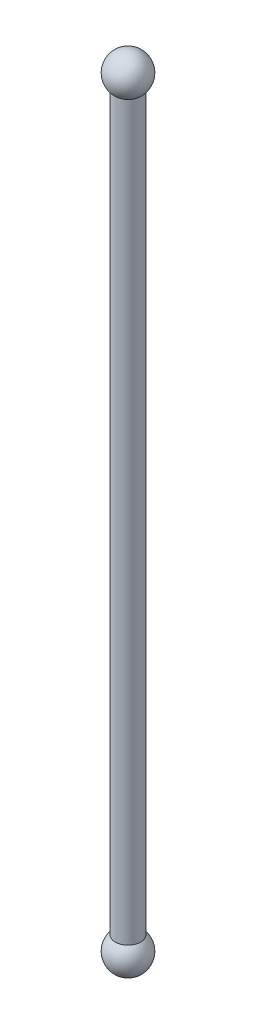
ISO-10303-21;
HEADER;
FILE_DESCRIPTION(('STEP AP214'),'2;1');
FILE_NAME('part.step','',(''),(''),'','','');
FILE_SCHEMA(('AUTOMOTIVE_DESIGN { 1 0 10303 214 1 1 1 1 }'));
ENDSEC;
DATA;
#1=APPLICATION_CONTEXT('core data for automotive mechanical design processes');
#2=APPLICATION_PROTOCOL_DEFINITION('international standard','automotive_design',2000,#1);
#3=PRODUCT_CONTEXT('',#1,'mechanical');
#4=PRODUCT('Part','Part','',(#3));
#5=PRODUCT_RELATED_PRODUCT_CATEGORY('part','',(#4));
#6=PRODUCT_DEFINITION_FORMATION('','',#4);
#7=PRODUCT_DEFINITION_CONTEXT('part definition',#1,'design');
#8=PRODUCT_DEFINITION('design','',#6,#7);
#9=PRODUCT_DEFINITION_SHAPE('','',#8);
#10=(LENGTH_UNIT() NAMED_UNIT(*) SI_UNIT(.MILLI.,.METRE.));
#11=(NAMED_UNIT(*) PLANE_ANGLE_UNIT() SI_UNIT($,.RADIAN.));
#12=(NAMED_UNIT(*) SI_UNIT($,.STERADIAN.) SOLID_ANGLE_UNIT());
#13=UNCERTAINTY_MEASURE_WITH_UNIT(LENGTH_MEASURE(1.E-05),#10,'distance_accuracy_value','');
#14=(GEOMETRIC_REPRESENTATION_CONTEXT(3) GLOBAL_UNCERTAINTY_ASSIGNED_CONTEXT((#13)) GLOBAL_UNIT_ASSIGNED_CONTEXT((#10,
#11,#12)) REPRESENTATION_CONTEXT('',''));
#15=CARTESIAN_POINT('',(0.,0.,0.));
#16=DIRECTION('',(0.,0.,1.));
#17=DIRECTION('',(1.,0.,0.));
#18=AXIS2_PLACEMENT_3D('',#15,#16,#17);
#19=CARTESIAN_POINT('',(0.,150.,0.));
#20=DIRECTION('',(0.,-1.,0.));
#21=DIRECTION('',(0.,0.,-1.));
#22=AXIS2_PLACEMENT_3D('',#19,#20,#21);
#23=CYLINDRICAL_SURFACE('',#22,5.);
#24=CARTESIAN_POINT('',(0.,144.409830056251,0.));
#25=DIRECTION('',(0.,0.999999999999998,0.));
#26=DIRECTION('',(0.,0.,1.));
#27=AXIS2_PLACEMENT_3D('',#24,#25,#26);
#28=CIRCLE('',#27,5.);
#29=CARTESIAN_POINT('',(0.,144.409830056251,-5.));
#30=VERTEX_POINT('',#29);
#31=EDGE_CURVE('E45',#30,#30,#28,.T.);
#32=CARTESIAN_POINT('',(0.,-144.409830056251,0.));
#33=DIRECTION('',(0.,-0.999999999999998,0.));
#34=DIRECTION('',(0.,0.,-1.));
#35=AXIS2_PLACEMENT_3D('',#32,#33,#34);
#36=CIRCLE('',#35,5.);
#37=CARTESIAN_POINT('',(0.,-144.409830056251,-5.));
#38=VERTEX_POINT('',#37);
#39=EDGE_CURVE('E10',#38,#38,#36,.T.);
#40=CARTESIAN_POINT('',(0.,144.409830056251,-5.));
#41=CARTESIAN_POINT('',(0.,141.401291930079,-5.));
#42=CARTESIAN_POINT('',(0.,138.392753803907,-5.));
#43=CARTESIAN_POINT('',(0.,132.375677551563,-5.));
#44=CARTESIAN_POINT('',(0.,129.367139425391,-5.));
#45=CARTESIAN_POINT('',(0.,123.350063173047,-5.));
#46=CARTESIAN_POINT('',(0.,120.341525046875,-5.));
#47=CARTESIAN_POINT('',(0.,114.324448794532,-5.));
#48=CARTESIAN_POINT('',(0.,111.31591066836,-5.));
#49=CARTESIAN_POINT('',(0.,105.298834416016,-5.));
#50=CARTESIAN_POINT('',(0.,102.290296289844,-5.));
#51=CARTESIAN_POINT('',(0.,96.2732200375003,-5.));
#52=CARTESIAN_POINT('',(0.,93.2646819113285,-5.));
#53=CARTESIAN_POINT('',(0.,87.2476056589847,-5.));
#54=CARTESIAN_POINT('',(0.,84.2390675328128,-5.));
#55=CARTESIAN_POINT('',(0.,78.221991280469,-5.));
#56=CARTESIAN_POINT('',(0.,75.2134531542971,-5.));
#57=CARTESIAN_POINT('',(0.,69.1963769019534,-5.));
#58=CARTESIAN_POINT('',(0.,66.1878387757815,-5.));
#59=CARTESIAN_POINT('',(0.,60.1707625234377,-5.));
#60=CARTESIAN_POINT('',(0.,57.1622243972658,-5.));
#61=CARTESIAN_POINT('',(0.,51.145148144922,-5.));
#62=CARTESIAN_POINT('',(0.,48.1366100187502,-5.));
#63=CARTESIAN_POINT('',(0.,42.1195337664064,-5.));
#64=CARTESIAN_POINT('',(0.,39.1109956402345,-5.));
#65=CARTESIAN_POINT('',(0.,33.0939193878907,-5.));
#66=CARTESIAN_POINT('',(0.,30.0853812617189,-5.));
#67=CARTESIAN_POINT('',(0.,24.0683050093751,-5.));
#68=CARTESIAN_POINT('',(0.,21.0597668832032,-5.));
#69=CARTESIAN_POINT('',(0.,15.0426906308594,-5.));
#70=CARTESIAN_POINT('',(0.,12.0341525046875,-5.));
#71=CARTESIAN_POINT('',(0.,6.01707625234376,-5.));
#72=CARTESIAN_POINT('',(0.,3.00853812617187,-5.));
#73=CARTESIAN_POINT('',(0.,-3.0085381261719,-5.));
#74=CARTESIAN_POINT('',(0.,-6.01707625234378,-5.));
#75=CARTESIAN_POINT('',(0.,-12.0341525046875,-5.));
#76=CARTESIAN_POINT('',(0.,-15.0426906308594,-5.));
#77=CARTESIAN_POINT('',(0.,-21.0597668832032,-5.));
#78=CARTESIAN_POINT('',(0.,-24.0683050093751,-5.));
#79=CARTESIAN_POINT('',(0.,-30.0853812617189,-5.));
#80=CARTESIAN_POINT('',(0.,-33.0939193878908,-5.));
#81=CARTESIAN_POINT('',(0.,-39.1109956402345,-5.));
#82=CARTESIAN_POINT('',(0.,-42.1195337664064,-5.));
#83=CARTESIAN_POINT('',(0.,-48.1366100187502,-5.));
#84=CARTESIAN_POINT('',(0.,-51.1451481449221,-5.));
#85=CARTESIAN_POINT('',(0.,-57.1622243972659,-5.));
#86=CARTESIAN_POINT('',(0.,-60.1707625234377,-5.));
#87=CARTESIAN_POINT('',(0.,-66.1878387757815,-5.));
#88=CARTESIAN_POINT('',(0.,-69.1963769019534,-5.));
#89=CARTESIAN_POINT('',(0.,-75.2134531542972,-5.));
#90=CARTESIAN_POINT('',(0.,-78.221991280469,-5.));
#91=CARTESIAN_POINT('',(0.,-84.2390675328128,-5.));
#92=CARTESIAN_POINT('',(0.,-87.2476056589847,-5.));
#93=CARTESIAN_POINT('',(0.,-93.2646819113285,-5.));
#94=CARTESIAN_POINT('',(0.,-96.2732200375004,-5.));
#95=CARTESIAN_POINT('',(0.,-102.290296289844,-5.));
#96=CARTESIAN_POINT('',(0.,-105.298834416016,-5.));
#97=CARTESIAN_POINT('',(0.,-111.31591066836,-5.));
#98=CARTESIAN_POINT('',(0.,-114.324448794532,-5.));
#99=CARTESIAN_POINT('',(0.,-120.341525046875,-5.));
#100=CARTESIAN_POINT('',(0.,-123.350063173047,-5.));
#101=CARTESIAN_POINT('',(0.,-129.367139425391,-5.));
#102=CARTESIAN_POINT('',(0.,-132.375677551563,-5.));
#103=CARTESIAN_POINT('',(0.,-138.392753803907,-5.));
#104=CARTESIAN_POINT('',(0.,-141.401291930079,-5.));
#105=CARTESIAN_POINT('',(0.,-144.409830056251,-5.));
#106=B_SPLINE_CURVE_WITH_KNOTS('',3,(#40,#41,#42,#43,#44,#45,#46,#47,#48,#49,#50,#51,#52,#53,
#54,#55,#56,#57,#58,#59,#60,#61,#62,#63,#64,#65,#66,#67,#68,#69,#70,#71,#72,#73,#74,#75,#76,#77,
#78,#79,#80,#81,#82,#83,#84,#85,#86,#87,#88,#89,#90,#91,#92,#93,#94,#95,#96,#97,#98,#99,#100,
#101,#102,#103,#104,#105),.UNSPECIFIED.,.F.,.F.,(4,2,2,2,2,2,2,2,2,2,2,2,2,2,2,2,2,2,2,2,2,2,2,
2,2,2,2,2,2,2,2,2,4),(0.,9.02561437851568,18.0512287570313,27.076843135547,36.1024575140626,
45.1280718925783,54.153686271094,63.1793006496096,72.2049150281253,81.2305294066409,
90.2561437851566,99.2817581636723,108.307372542188,117.332986920704,126.358601299219,
135.384215677735,144.409830056251,153.435444434766,162.461058813282,171.486673191798,
180.512287570313,189.537901948829,198.563516327345,207.58913070586,216.614745084376,
225.640359462891,234.665973841407,243.691588219923,252.717202598438,261.742816976954,
270.76843135547,279.794045733985,288.819660112501),.UNSPECIFIED.);
#107=EDGE_CURVE('BSEAM39',#30,#38,#106,.T.);
#108=ORIENTED_EDGE('',*,*,#31,.F.);
#109=ORIENTED_EDGE('',*,*,#39,.F.);
#110=ORIENTED_EDGE('',*,*,#107,.T.);
#111=ORIENTED_EDGE('',*,*,#107,.F.);
#112=EDGE_LOOP('',(#108,#110,#109,#111));
#113=FACE_BOUND('',#112,.T.);
#114=ADVANCED_FACE('F39',(#113),#23,.T.);
#115=CARTESIAN_POINT('',(0.,150.,0.));
#116=DIRECTION('',(0.,1.,0.));
#117=DIRECTION('',(1.,0.,0.));
#118=AXIS2_PLACEMENT_3D('',#115,#116,#117);
#119=SPHERICAL_SURFACE('',#118,7.50000000000001);
#120=ORIENTED_EDGE('',*,*,#31,.T.);
#121=EDGE_LOOP('',(#120));
#122=FACE_BOUND('',#121,.T.);
#123=ADVANCED_FACE('F51',(#122),#119,.T.);
#124=CARTESIAN_POINT('',(0.,-150.,0.));
#125=DIRECTION('',(0.,-1.,0.));
#126=DIRECTION('',(1.,0.,0.));
#127=AXIS2_PLACEMENT_3D('',#124,#125,#126);
#128=SPHERICAL_SURFACE('',#127,7.50000000000001);
#129=ORIENTED_EDGE('',*,*,#39,.T.);
#130=EDGE_LOOP('',(#129));
#131=FACE_BOUND('',#130,.T.);
#132=ADVANCED_FACE('F58',(#131),#128,.T.);
#133=CLOSED_SHELL('',(#114,#123,#132));
#134=MANIFOLD_SOLID_BREP('B2',#133);
#135=ADVANCED_BREP_SHAPE_REPRESENTATION('',(#18,#134),#14);
#136=SHAPE_DEFINITION_REPRESENTATION(#9,#135);
ENDSEC;
END-ISO-10303-21;
